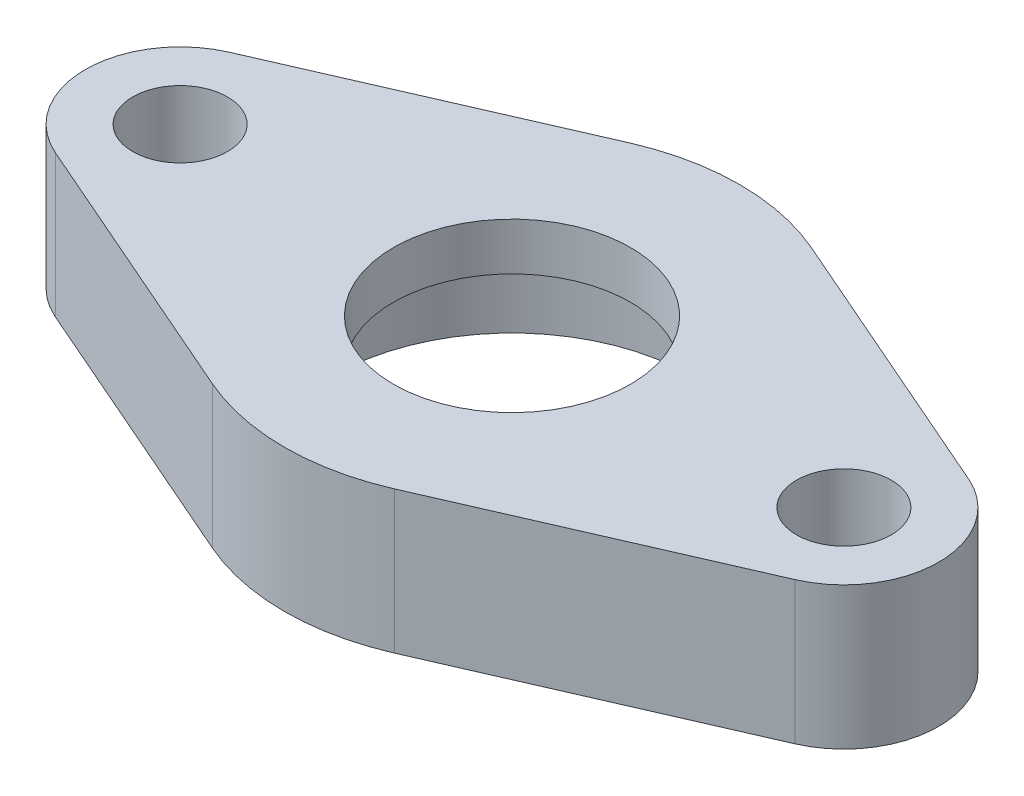
ISO-10303-21;
HEADER;
FILE_DESCRIPTION(('STEP AP214'),'2;1');
FILE_NAME('part.step','',(''),(''),'','','');
FILE_SCHEMA(('AUTOMOTIVE_DESIGN { 1 0 10303 214 1 1 1 1 }'));
ENDSEC;
DATA;
#1=APPLICATION_CONTEXT('core data for automotive mechanical design processes');
#2=APPLICATION_PROTOCOL_DEFINITION('international standard','automotive_design',2000,#1);
#3=PRODUCT_CONTEXT('',#1,'mechanical');
#4=PRODUCT('Part','Part','',(#3));
#5=PRODUCT_RELATED_PRODUCT_CATEGORY('part','',(#4));
#6=PRODUCT_DEFINITION_FORMATION('','',#4);
#7=PRODUCT_DEFINITION_CONTEXT('part definition',#1,'design');
#8=PRODUCT_DEFINITION('design','',#6,#7);
#9=PRODUCT_DEFINITION_SHAPE('','',#8);
#10=(LENGTH_UNIT() NAMED_UNIT(*) SI_UNIT(.MILLI.,.METRE.));
#11=(NAMED_UNIT(*) PLANE_ANGLE_UNIT() SI_UNIT($,.RADIAN.));
#12=(NAMED_UNIT(*) SI_UNIT($,.STERADIAN.) SOLID_ANGLE_UNIT());
#13=UNCERTAINTY_MEASURE_WITH_UNIT(LENGTH_MEASURE(1.E-05),#10,'distance_accuracy_value','');
#14=(GEOMETRIC_REPRESENTATION_CONTEXT(3) GLOBAL_UNCERTAINTY_ASSIGNED_CONTEXT((#13)) GLOBAL_UNIT_ASSIGNED_CONTEXT((#10,
#11,#12)) REPRESENTATION_CONTEXT('',''));
#15=CARTESIAN_POINT('',(0.,0.,0.));
#16=DIRECTION('',(0.,0.,1.));
#17=DIRECTION('',(1.,0.,0.));
#18=AXIS2_PLACEMENT_3D('',#15,#16,#17);
#19=CARTESIAN_POINT('',(-3.84,4.,-8.79854533431522));
#20=DIRECTION('',(0.4,0.,0.916515138991168));
#21=DIRECTION('',(0.916515138991168,0.,-0.4));
#22=AXIS2_PLACEMENT_3D('',#19,#20,#21);
#23=PLANE('',#22);
#24=DIRECTION('',(-0.916515138991168,0.,0.4));
#25=VECTOR('',#24,1.);
#26=CARTESIAN_POINT('',(-3.84,0.,-8.79854533431522));
#27=LINE('',#26,#25);
#28=CARTESIAN_POINT('',(-3.84,0.,-8.79854533431522));
#29=VERTEX_POINT('',#28);
#30=CARTESIAN_POINT('',(-15.6,0.,-3.66606055596468));
#31=VERTEX_POINT('',#30);
#32=EDGE_CURVE('E143',#29,#31,#27,.T.);
#33=ORIENTED_EDGE('',*,*,#32,.T.);
#34=DIRECTION('',(0.,-1.,0.));
#35=VECTOR('',#34,1.);
#36=CARTESIAN_POINT('',(-15.6,4.,-3.66606055596468));
#37=LINE('',#36,#35);
#38=CARTESIAN_POINT('',(-15.6,6.,-3.66606055596468));
#39=VERTEX_POINT('',#38);
#40=EDGE_CURVE('E11',#39,#31,#37,.T.);
#41=ORIENTED_EDGE('',*,*,#40,.F.);
#42=DIRECTION('',(-0.916515138991168,0.,0.4));
#43=VECTOR('',#42,1.);
#44=CARTESIAN_POINT('',(-3.84,6.,-8.79854533431522));
#45=LINE('',#44,#43);
#46=CARTESIAN_POINT('',(-3.84,6.,-8.79854533431522));
#47=VERTEX_POINT('',#46);
#48=EDGE_CURVE('E105',#47,#39,#45,.T.);
#49=ORIENTED_EDGE('',*,*,#48,.F.);
#50=DIRECTION('',(0.,-1.,0.));
#51=VECTOR('',#50,1.);
#52=CARTESIAN_POINT('',(-3.84,4.,-8.79854533431522));
#53=LINE('',#52,#51);
#54=EDGE_CURVE('E94',#47,#29,#53,.T.);
#55=ORIENTED_EDGE('',*,*,#54,.T.);
#56=EDGE_LOOP('',(#33,#41,#49,#55));
#57=FACE_BOUND('',#56,.T.);
#58=ADVANCED_FACE('F34',(#57),#23,.F.);
#59=CARTESIAN_POINT('',(-14.,4.,0.));
#60=DIRECTION('',(0.,-1.,0.));
#61=DIRECTION('',(0.,0.,-1.));
#62=AXIS2_PLACEMENT_3D('',#59,#60,#61);
#63=CYLINDRICAL_SURFACE('',#62,4.);
#64=CARTESIAN_POINT('',(-14.,0.,0.));
#65=DIRECTION('',(0.,1.,0.));
#66=DIRECTION('',(0.,0.,1.));
#67=AXIS2_PLACEMENT_3D('',#64,#65,#66);
#68=CIRCLE('',#67,4.);
#69=CARTESIAN_POINT('',(-15.6,0.,3.66606055596467));
#70=VERTEX_POINT('',#69);
#71=EDGE_CURVE('E145',#31,#70,#68,.T.);
#72=ORIENTED_EDGE('',*,*,#71,.T.);
#73=DIRECTION('',(0.,-1.,0.));
#74=VECTOR('',#73,1.);
#75=CARTESIAN_POINT('',(-15.6,4.,3.66606055596467));
#76=LINE('',#75,#74);
#77=CARTESIAN_POINT('',(-15.6,6.,3.66606055596468));
#78=VERTEX_POINT('',#77);
#79=EDGE_CURVE('E42',#78,#70,#76,.T.);
#80=ORIENTED_EDGE('',*,*,#79,.F.);
#81=CARTESIAN_POINT('',(-14.,6.,0.));
#82=DIRECTION('',(0.,1.,0.));
#83=DIRECTION('',(0.,0.,1.));
#84=AXIS2_PLACEMENT_3D('',#81,#82,#83);
#85=CIRCLE('',#84,4.);
#86=EDGE_CURVE('E109',#39,#78,#85,.T.);
#87=ORIENTED_EDGE('',*,*,#86,.F.);
#88=ORIENTED_EDGE('',*,*,#40,.T.);
#89=EDGE_LOOP('',(#72,#80,#87,#88));
#90=FACE_BOUND('',#89,.T.);
#91=ADVANCED_FACE('F190',(#90),#63,.T.);
#92=CARTESIAN_POINT('',(-3.84,4.,8.79854533431521));
#93=DIRECTION('',(0.4,0.,-0.916515138991168));
#94=DIRECTION('',(-0.916515138991168,0.,-0.4));
#95=AXIS2_PLACEMENT_3D('',#92,#93,#94);
#96=PLANE('',#95);
#97=DIRECTION('',(0.916515138991168,0.,0.4));
#98=VECTOR('',#97,1.);
#99=CARTESIAN_POINT('',(-3.84,0.,8.79854533431521));
#100=LINE('',#99,#98);
#101=CARTESIAN_POINT('',(-3.84,0.,8.79854533431521));
#102=VERTEX_POINT('',#101);
#103=EDGE_CURVE('E147',#70,#102,#100,.T.);
#104=ORIENTED_EDGE('',*,*,#103,.T.);
#105=DIRECTION('',(0.,-1.,0.));
#106=VECTOR('',#105,1.);
#107=CARTESIAN_POINT('',(-3.84,4.,8.79854533431521));
#108=LINE('',#107,#106);
#109=CARTESIAN_POINT('',(-3.84,6.,8.79854533431521));
#110=VERTEX_POINT('',#109);
#111=EDGE_CURVE('E173',#110,#102,#108,.T.);
#112=ORIENTED_EDGE('',*,*,#111,.F.);
#113=DIRECTION('',(0.916515138991168,0.,0.4));
#114=VECTOR('',#113,1.);
#115=CARTESIAN_POINT('',(-15.6,6.,3.66606055596467));
#116=LINE('',#115,#114);
#117=EDGE_CURVE('E125',#78,#110,#116,.T.);
#118=ORIENTED_EDGE('',*,*,#117,.F.);
#119=ORIENTED_EDGE('',*,*,#79,.T.);
#120=EDGE_LOOP('',(#104,#112,#118,#119));
#121=FACE_BOUND('',#120,.T.);
#122=ADVANCED_FACE('F179',(#121),#96,.F.);
#123=CARTESIAN_POINT('',(0.,4.,0.));
#124=DIRECTION('',(0.,-1.,0.));
#125=DIRECTION('',(0.,0.,-1.));
#126=AXIS2_PLACEMENT_3D('',#123,#124,#125);
#127=CYLINDRICAL_SURFACE('',#126,9.6);
#128=CARTESIAN_POINT('',(0.,0.,0.));
#129=DIRECTION('',(0.,1.,0.));
#130=DIRECTION('',(0.,0.,1.));
#131=AXIS2_PLACEMENT_3D('',#128,#129,#130);
#132=CIRCLE('',#131,9.6);
#133=CARTESIAN_POINT('',(3.84,0.,8.79854533431521));
#134=VERTEX_POINT('',#133);
#135=EDGE_CURVE('E149',#102,#134,#132,.T.);
#136=ORIENTED_EDGE('',*,*,#135,.T.);
#137=DIRECTION('',(0.,-1.,0.));
#138=VECTOR('',#137,1.);
#139=CARTESIAN_POINT('',(3.84,4.,8.79854533431521));
#140=LINE('',#139,#138);
#141=CARTESIAN_POINT('',(3.84,6.,8.79854533431521));
#142=VERTEX_POINT('',#141);
#143=EDGE_CURVE('E171',#142,#134,#140,.T.);
#144=ORIENTED_EDGE('',*,*,#143,.F.);
#145=CARTESIAN_POINT('',(0.,6.,0.));
#146=DIRECTION('',(0.,1.,0.));
#147=DIRECTION('',(0.,0.,1.));
#148=AXIS2_PLACEMENT_3D('',#145,#146,#147);
#149=CIRCLE('',#148,9.6);
#150=EDGE_CURVE('E128',#110,#142,#149,.T.);
#151=ORIENTED_EDGE('',*,*,#150,.F.);
#152=ORIENTED_EDGE('',*,*,#111,.T.);
#153=EDGE_LOOP('',(#136,#144,#151,#152));
#154=FACE_BOUND('',#153,.T.);
#155=ADVANCED_FACE('F187',(#154),#127,.T.);
#156=CARTESIAN_POINT('',(3.84,4.,8.79854533431521));
#157=DIRECTION('',(0.4,0.,0.916515138991168));
#158=DIRECTION('',(0.916515138991168,0.,-0.4));
#159=AXIS2_PLACEMENT_3D('',#156,#157,#158);
#160=PLANE('',#159);
#161=DIRECTION('',(-0.916515138991168,0.,0.4));
#162=VECTOR('',#161,1.);
#163=CARTESIAN_POINT('',(3.84,0.,8.79854533431521));
#164=LINE('',#163,#162);
#165=CARTESIAN_POINT('',(15.6,0.,3.66606055596467));
#166=VERTEX_POINT('',#165);
#167=EDGE_CURVE('E152',#166,#134,#164,.T.);
#168=ORIENTED_EDGE('',*,*,#167,.F.);
#169=DIRECTION('',(0.,-1.,0.));
#170=VECTOR('',#169,1.);
#171=CARTESIAN_POINT('',(15.6,4.,3.66606055596467));
#172=LINE('',#171,#170);
#173=CARTESIAN_POINT('',(15.6,6.,3.66606055596467));
#174=VERTEX_POINT('',#173);
#175=EDGE_CURVE('E169',#174,#166,#172,.T.);
#176=ORIENTED_EDGE('',*,*,#175,.F.);
#177=DIRECTION('',(0.916515138991168,0.,-0.4));
#178=VECTOR('',#177,1.);
#179=CARTESIAN_POINT('',(3.84,6.,8.79854533431521));
#180=LINE('',#179,#178);
#181=EDGE_CURVE('E131',#142,#174,#180,.T.);
#182=ORIENTED_EDGE('',*,*,#181,.F.);
#183=ORIENTED_EDGE('',*,*,#143,.T.);
#184=EDGE_LOOP('',(#168,#176,#182,#183));
#185=FACE_BOUND('',#184,.T.);
#186=ADVANCED_FACE('F199',(#185),#160,.T.);
#187=CARTESIAN_POINT('',(14.,4.,0.));
#188=DIRECTION('',(0.,-1.,0.));
#189=DIRECTION('',(0.,0.,-1.));
#190=AXIS2_PLACEMENT_3D('',#187,#188,#189);
#191=CYLINDRICAL_SURFACE('',#190,4.);
#192=CARTESIAN_POINT('',(14.,0.,0.));
#193=DIRECTION('',(0.,1.,0.));
#194=DIRECTION('',(0.,0.,1.));
#195=AXIS2_PLACEMENT_3D('',#192,#193,#194);
#196=CIRCLE('',#195,4.);
#197=CARTESIAN_POINT('',(15.6,0.,-3.66606055596467));
#198=VERTEX_POINT('',#197);
#199=EDGE_CURVE('E155',#198,#166,#196,.F.);
#200=ORIENTED_EDGE('',*,*,#199,.F.);
#201=DIRECTION('',(0.,-1.,0.));
#202=VECTOR('',#201,1.);
#203=CARTESIAN_POINT('',(15.6,4.,-3.66606055596467));
#204=LINE('',#203,#202);
#205=CARTESIAN_POINT('',(15.6,6.,-3.66606055596467));
#206=VERTEX_POINT('',#205);
#207=EDGE_CURVE('E167',#206,#198,#204,.T.);
#208=ORIENTED_EDGE('',*,*,#207,.F.);
#209=CARTESIAN_POINT('',(14.,6.,0.));
#210=DIRECTION('',(0.,1.,0.));
#211=DIRECTION('',(0.,0.,1.));
#212=AXIS2_PLACEMENT_3D('',#209,#210,#211);
#213=CIRCLE('',#212,4.);
#214=EDGE_CURVE('E134',#174,#206,#213,.T.);
#215=ORIENTED_EDGE('',*,*,#214,.F.);
#216=ORIENTED_EDGE('',*,*,#175,.T.);
#217=EDGE_LOOP('',(#200,#208,#215,#216));
#218=FACE_BOUND('',#217,.T.);
#219=ADVANCED_FACE('F197',(#218),#191,.T.);
#220=CARTESIAN_POINT('',(3.84,4.,-8.79854533431521));
#221=DIRECTION('',(0.4,0.,-0.916515138991168));
#222=DIRECTION('',(-0.916515138991168,0.,-0.4));
#223=AXIS2_PLACEMENT_3D('',#220,#221,#222);
#224=PLANE('',#223);
#225=DIRECTION('',(0.916515138991168,0.,0.4));
#226=VECTOR('',#225,1.);
#227=CARTESIAN_POINT('',(3.84,0.,-8.79854533431521));
#228=LINE('',#227,#226);
#229=CARTESIAN_POINT('',(3.84,0.,-8.79854533431521));
#230=VERTEX_POINT('',#229);
#231=EDGE_CURVE('E158',#230,#198,#228,.T.);
#232=ORIENTED_EDGE('',*,*,#231,.F.);
#233=DIRECTION('',(0.,-1.,0.));
#234=VECTOR('',#233,1.);
#235=CARTESIAN_POINT('',(3.84,4.,-8.79854533431521));
#236=LINE('',#235,#234);
#237=CARTESIAN_POINT('',(3.84,6.,-8.79854533431521));
#238=VERTEX_POINT('',#237);
#239=EDGE_CURVE('E54',#238,#230,#236,.T.);
#240=ORIENTED_EDGE('',*,*,#239,.F.);
#241=DIRECTION('',(-0.916515138991168,0.,-0.4));
#242=VECTOR('',#241,1.);
#243=CARTESIAN_POINT('',(15.6,6.,-3.66606055596467));
#244=LINE('',#243,#242);
#245=EDGE_CURVE('E116',#206,#238,#244,.T.);
#246=ORIENTED_EDGE('',*,*,#245,.F.);
#247=ORIENTED_EDGE('',*,*,#207,.T.);
#248=EDGE_LOOP('',(#232,#240,#246,#247));
#249=FACE_BOUND('',#248,.T.);
#250=ADVANCED_FACE('F193',(#249),#224,.T.);
#251=CARTESIAN_POINT('',(0.,4.,0.));
#252=DIRECTION('',(0.,-1.,0.));
#253=DIRECTION('',(0.,0.,-1.));
#254=AXIS2_PLACEMENT_3D('',#251,#252,#253);
#255=CYLINDRICAL_SURFACE('',#254,7.6);
#256=CARTESIAN_POINT('',(0.,4.,0.));
#257=DIRECTION('',(0.,1.,0.));
#258=DIRECTION('',(0.,0.,1.));
#259=AXIS2_PLACEMENT_3D('',#256,#257,#258);
#260=CIRCLE('',#259,7.6);
#261=CARTESIAN_POINT('',(0.,4.,7.6));
#262=VERTEX_POINT('',#261);
#263=EDGE_CURVE('E137',#262,#262,#260,.T.);
#264=ORIENTED_EDGE('',*,*,#263,.T.);
#265=EDGE_LOOP('',(#264));
#266=FACE_BOUND('',#265,.T.);
#267=CARTESIAN_POINT('',(0.,0.,0.));
#268=DIRECTION('',(0.,1.,0.));
#269=DIRECTION('',(0.,0.,1.));
#270=AXIS2_PLACEMENT_3D('',#267,#268,#269);
#271=CIRCLE('',#270,7.6);
#272=CARTESIAN_POINT('',(0.,0.,7.6));
#273=VERTEX_POINT('',#272);
#274=EDGE_CURVE('E161',#273,#273,#271,.T.);
#275=ORIENTED_EDGE('',*,*,#274,.F.);
#276=EDGE_LOOP('',(#275));
#277=FACE_BOUND('',#276,.T.);
#278=ADVANCED_FACE('F245',(#266,#277),#255,.F.);
#279=EDGE_CURVE('E49',#230,#29,#132,.T.);
#280=ORIENTED_EDGE('',*,*,#279,.T.);
#281=ORIENTED_EDGE('',*,*,#54,.F.);
#282=CARTESIAN_POINT('',(0.,6.,0.));
#283=DIRECTION('',(0.,1.,0.));
#284=DIRECTION('',(0.,0.,1.));
#285=AXIS2_PLACEMENT_3D('',#282,#283,#284);
#286=CIRCLE('',#285,9.6);
#287=EDGE_CURVE('E98',#238,#47,#286,.T.);
#288=ORIENTED_EDGE('',*,*,#287,.F.);
#289=ORIENTED_EDGE('',*,*,#239,.T.);
#290=EDGE_LOOP('',(#280,#281,#288,#289));
#291=FACE_BOUND('',#290,.T.);
#292=ADVANCED_FACE('F96',(#291),#127,.T.);
#293=CARTESIAN_POINT('',(-14.,4.,0.));
#294=DIRECTION('',(0.,-1.,0.));
#295=DIRECTION('',(0.,0.,-1.));
#296=AXIS2_PLACEMENT_3D('',#293,#294,#295);
#297=CYLINDRICAL_SURFACE('',#296,2.);
#298=CARTESIAN_POINT('',(-14.,0.,0.));
#299=DIRECTION('',(0.,1.,0.));
#300=DIRECTION('',(0.,0.,1.));
#301=AXIS2_PLACEMENT_3D('',#298,#299,#300);
#302=CIRCLE('',#301,2.);
#303=CARTESIAN_POINT('',(-14.,0.,2.));
#304=VERTEX_POINT('',#303);
#305=EDGE_CURVE('E140',#304,#304,#302,.T.);
#306=ORIENTED_EDGE('',*,*,#305,.F.);
#307=EDGE_LOOP('',(#306));
#308=FACE_BOUND('',#307,.T.);
#309=CARTESIAN_POINT('',(-14.,6.,0.));
#310=DIRECTION('',(0.,1.,0.));
#311=DIRECTION('',(0.,0.,1.));
#312=AXIS2_PLACEMENT_3D('',#309,#310,#311);
#313=CIRCLE('',#312,2.);
#314=CARTESIAN_POINT('',(-14.,6.,2.));
#315=VERTEX_POINT('',#314);
#316=EDGE_CURVE('E117',#315,#315,#313,.T.);
#317=ORIENTED_EDGE('',*,*,#316,.T.);
#318=EDGE_LOOP('',(#317));
#319=FACE_BOUND('',#318,.T.);
#320=ADVANCED_FACE('F36',(#308,#319),#297,.F.);
#321=CARTESIAN_POINT('',(14.,4.,0.));
#322=DIRECTION('',(0.,-1.,0.));
#323=DIRECTION('',(0.,0.,-1.));
#324=AXIS2_PLACEMENT_3D('',#321,#322,#323);
#325=CYLINDRICAL_SURFACE('',#324,2.);
#326=CARTESIAN_POINT('',(14.,0.,0.));
#327=DIRECTION('',(0.,1.,0.));
#328=DIRECTION('',(0.,0.,1.));
#329=AXIS2_PLACEMENT_3D('',#326,#327,#328);
#330=CIRCLE('',#329,2.);
#331=CARTESIAN_POINT('',(14.,0.,2.));
#332=VERTEX_POINT('',#331);
#333=EDGE_CURVE('E102',#332,#332,#330,.F.);
#334=ORIENTED_EDGE('',*,*,#333,.T.);
#335=EDGE_LOOP('',(#334));
#336=FACE_BOUND('',#335,.T.);
#337=CARTESIAN_POINT('',(14.,6.,0.));
#338=DIRECTION('',(0.,1.,0.));
#339=DIRECTION('',(0.,0.,1.));
#340=AXIS2_PLACEMENT_3D('',#337,#338,#339);
#341=CIRCLE('',#340,2.);
#342=CARTESIAN_POINT('',(14.,6.,2.));
#343=VERTEX_POINT('',#342);
#344=EDGE_CURVE('E120',#343,#343,#341,.T.);
#345=ORIENTED_EDGE('',*,*,#344,.T.);
#346=EDGE_LOOP('',(#345));
#347=FACE_BOUND('',#346,.T.);
#348=ADVANCED_FACE('F264',(#336,#347),#325,.F.);
#349=CARTESIAN_POINT('',(0.,0.,0.));
#350=DIRECTION('',(0.,1.,0.));
#351=DIRECTION('',(0.,0.,1.));
#352=AXIS2_PLACEMENT_3D('',#349,#350,#351);
#353=PLANE('',#352);
#354=ORIENTED_EDGE('',*,*,#305,.T.);
#355=EDGE_LOOP('',(#354));
#356=FACE_BOUND('',#355,.T.);
#357=ORIENTED_EDGE('',*,*,#32,.F.);
#358=ORIENTED_EDGE('',*,*,#279,.F.);
#359=ORIENTED_EDGE('',*,*,#231,.T.);
#360=ORIENTED_EDGE('',*,*,#199,.T.);
#361=ORIENTED_EDGE('',*,*,#167,.T.);
#362=ORIENTED_EDGE('',*,*,#135,.F.);
#363=ORIENTED_EDGE('',*,*,#103,.F.);
#364=ORIENTED_EDGE('',*,*,#71,.F.);
#365=EDGE_LOOP('',(#357,#358,#359,#360,#361,#362,#363,#364));
#366=FACE_BOUND('',#365,.T.);
#367=ORIENTED_EDGE('',*,*,#274,.T.);
#368=EDGE_LOOP('',(#367));
#369=FACE_BOUND('',#368,.T.);
#370=ORIENTED_EDGE('',*,*,#333,.F.);
#371=EDGE_LOOP('',(#370));
#372=FACE_BOUND('',#371,.T.);
#373=ADVANCED_FACE('F183',(#356,#366,#369,#372),#353,.F.);
#374=CARTESIAN_POINT('',(0.,4.,0.));
#375=DIRECTION('',(0.,1.,0.));
#376=DIRECTION('',(0.,0.,1.));
#377=AXIS2_PLACEMENT_3D('',#374,#375,#376);
#378=PLANE('',#377);
#379=CARTESIAN_POINT('',(0.,4.,0.));
#380=DIRECTION('',(0.,1.,0.));
#381=DIRECTION('',(0.,0.,1.));
#382=AXIS2_PLACEMENT_3D('',#379,#380,#381);
#383=CIRCLE('',#382,5.);
#384=CARTESIAN_POINT('',(0.,4.,5.));
#385=VERTEX_POINT('',#384);
#386=EDGE_CURVE('E326',#385,#385,#383,.T.);
#387=ORIENTED_EDGE('',*,*,#386,.T.);
#388=EDGE_LOOP('',(#387));
#389=FACE_BOUND('',#388,.T.);
#390=ORIENTED_EDGE('',*,*,#263,.F.);
#391=EDGE_LOOP('',(#390));
#392=FACE_BOUND('',#391,.T.);
#393=ADVANCED_FACE('F282',(#389,#392),#378,.F.);
#394=CARTESIAN_POINT('',(0.,6.,0.));
#395=DIRECTION('',(0.,1.,0.));
#396=DIRECTION('',(0.,0.,1.));
#397=AXIS2_PLACEMENT_3D('',#394,#395,#396);
#398=PLANE('',#397);
#399=ORIENTED_EDGE('',*,*,#344,.F.);
#400=EDGE_LOOP('',(#399));
#401=FACE_BOUND('',#400,.T.);
#402=ORIENTED_EDGE('',*,*,#287,.T.);
#403=ORIENTED_EDGE('',*,*,#48,.T.);
#404=ORIENTED_EDGE('',*,*,#86,.T.);
#405=ORIENTED_EDGE('',*,*,#117,.T.);
#406=ORIENTED_EDGE('',*,*,#150,.T.);
#407=ORIENTED_EDGE('',*,*,#181,.T.);
#408=ORIENTED_EDGE('',*,*,#214,.T.);
#409=ORIENTED_EDGE('',*,*,#245,.T.);
#410=EDGE_LOOP('',(#402,#403,#404,#405,#406,#407,#408,#409));
#411=FACE_BOUND('',#410,.T.);
#412=ORIENTED_EDGE('',*,*,#316,.F.);
#413=EDGE_LOOP('',(#412));
#414=FACE_BOUND('',#413,.T.);
#415=CARTESIAN_POINT('',(0.,6.,0.));
#416=DIRECTION('',(0.,1.,0.));
#417=DIRECTION('',(0.,0.,1.));
#418=AXIS2_PLACEMENT_3D('',#415,#416,#417);
#419=CIRCLE('',#418,5.);
#420=CARTESIAN_POINT('',(0.,6.,5.));
#421=VERTEX_POINT('',#420);
#422=EDGE_CURVE('E325',#421,#421,#419,.T.);
#423=ORIENTED_EDGE('',*,*,#422,.F.);
#424=EDGE_LOOP('',(#423));
#425=FACE_BOUND('',#424,.T.);
#426=ADVANCED_FACE('F112',(#401,#411,#414,#425),#398,.T.);
#427=CARTESIAN_POINT('',(0.,6.,0.));
#428=DIRECTION('',(0.,-1.,0.));
#429=DIRECTION('',(0.,0.,-1.));
#430=AXIS2_PLACEMENT_3D('',#427,#428,#429);
#431=CYLINDRICAL_SURFACE('',#430,5.);
#432=ORIENTED_EDGE('',*,*,#422,.T.);
#433=EDGE_LOOP('',(#432));
#434=FACE_BOUND('',#433,.T.);
#435=ORIENTED_EDGE('',*,*,#386,.F.);
#436=EDGE_LOOP('',(#435));
#437=FACE_BOUND('',#436,.T.);
#438=ADVANCED_FACE('F295',(#434,#437),#431,.F.);
#439=CLOSED_SHELL('',(#58,#91,#122,#155,#186,#219,#250,#278,#292,#320,#348,#373,#393,#426,#438));
#440=MANIFOLD_SOLID_BREP('B2',#439);
#441=ADVANCED_BREP_SHAPE_REPRESENTATION('',(#18,#440),#14);
#442=SHAPE_DEFINITION_REPRESENTATION(#9,#441);
ENDSEC;
END-ISO-10303-21;
